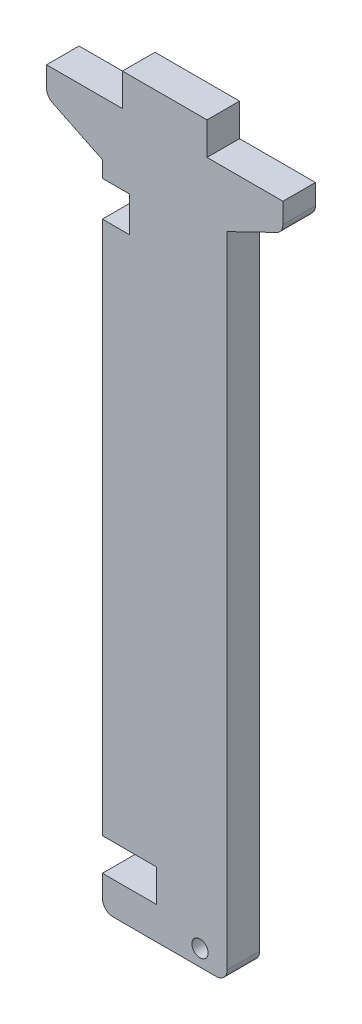
ISO-10303-21;
HEADER;
FILE_DESCRIPTION(('STEP AP214'),'2;1');
FILE_NAME('part.step','',(''),(''),'','','');
FILE_SCHEMA(('AUTOMOTIVE_DESIGN { 1 0 10303 214 1 1 1 1 }'));
ENDSEC;
DATA;
#1=APPLICATION_CONTEXT('core data for automotive mechanical design processes');
#2=APPLICATION_PROTOCOL_DEFINITION('international standard','automotive_design',2000,#1);
#3=PRODUCT_CONTEXT('',#1,'mechanical');
#4=PRODUCT('Part','Part','',(#3));
#5=PRODUCT_RELATED_PRODUCT_CATEGORY('part','',(#4));
#6=PRODUCT_DEFINITION_FORMATION('','',#4);
#7=PRODUCT_DEFINITION_CONTEXT('part definition',#1,'design');
#8=PRODUCT_DEFINITION('design','',#6,#7);
#9=PRODUCT_DEFINITION_SHAPE('','',#8);
#10=(LENGTH_UNIT() NAMED_UNIT(*) SI_UNIT(.MILLI.,.METRE.));
#11=(NAMED_UNIT(*) PLANE_ANGLE_UNIT() SI_UNIT($,.RADIAN.));
#12=(NAMED_UNIT(*) SI_UNIT($,.STERADIAN.) SOLID_ANGLE_UNIT());
#13=UNCERTAINTY_MEASURE_WITH_UNIT(LENGTH_MEASURE(1.E-05),#10,'distance_accuracy_value','');
#14=(GEOMETRIC_REPRESENTATION_CONTEXT(3) GLOBAL_UNCERTAINTY_ASSIGNED_CONTEXT((#13)) GLOBAL_UNIT_ASSIGNED_CONTEXT((#10,
#11,#12)) REPRESENTATION_CONTEXT('',''));
#15=CARTESIAN_POINT('',(0.,0.,0.));
#16=DIRECTION('',(0.,0.,1.));
#17=DIRECTION('',(1.,0.,0.));
#18=AXIS2_PLACEMENT_3D('',#15,#16,#17);
#19=CARTESIAN_POINT('',(10.3,0.,0.));
#20=DIRECTION('',(1.,0.,0.));
#21=DIRECTION('',(0.,1.,0.));
#22=AXIS2_PLACEMENT_3D('',#19,#20,#21);
#23=PLANE('',#22);
#24=DIRECTION('',(0.,1.,0.));
#25=VECTOR('',#24,1.);
#26=CARTESIAN_POINT('',(10.3,0.,0.));
#27=LINE('',#26,#25);
#28=CARTESIAN_POINT('',(10.3,117.,0.));
#29=VERTEX_POINT('',#28);
#30=CARTESIAN_POINT('',(10.3,120.,0.));
#31=VERTEX_POINT('',#30);
#32=EDGE_CURVE('E224',#29,#31,#27,.T.);
#33=ORIENTED_EDGE('',*,*,#32,.F.);
#34=DIRECTION('',(0.,0.,1.));
#35=VECTOR('',#34,1.);
#36=CARTESIAN_POINT('',(10.3,117.,0.));
#37=LINE('',#36,#35);
#38=CARTESIAN_POINT('',(10.3,117.,6.));
#39=VERTEX_POINT('',#38);
#40=EDGE_CURVE('E392',#29,#39,#37,.T.);
#41=ORIENTED_EDGE('',*,*,#40,.T.);
#42=DIRECTION('',(0.,1.,0.));
#43=VECTOR('',#42,1.);
#44=CARTESIAN_POINT('',(10.3,0.,6.));
#45=LINE('',#44,#43);
#46=CARTESIAN_POINT('',(10.3,120.,6.));
#47=VERTEX_POINT('',#46);
#48=EDGE_CURVE('E236',#39,#47,#45,.T.);
#49=ORIENTED_EDGE('',*,*,#48,.T.);
#50=DIRECTION('',(0.,0.,1.));
#51=VECTOR('',#50,1.);
#52=CARTESIAN_POINT('',(10.3,120.,0.));
#53=LINE('',#52,#51);
#54=EDGE_CURVE('E233',#31,#47,#53,.T.);
#55=ORIENTED_EDGE('',*,*,#54,.F.);
#56=EDGE_LOOP('',(#33,#41,#49,#55));
#57=FACE_BOUND('',#56,.T.);
#58=ADVANCED_FACE('F33',(#57),#23,.F.);
#59=CARTESIAN_POINT('',(10.3,12.,6.));
#60=VERTEX_POINT('',#59);
#61=CARTESIAN_POINT('',(10.3,110.5,6.));
#62=VERTEX_POINT('',#61);
#63=EDGE_CURVE('E214',#60,#62,#45,.T.);
#64=ORIENTED_EDGE('',*,*,#63,.T.);
#65=DIRECTION('',(0.,0.,1.));
#66=VECTOR('',#65,1.);
#67=CARTESIAN_POINT('',(10.3,110.5,0.));
#68=LINE('',#67,#66);
#69=CARTESIAN_POINT('',(10.3,110.5,0.));
#70=VERTEX_POINT('',#69);
#71=EDGE_CURVE('E199',#70,#62,#68,.T.);
#72=ORIENTED_EDGE('',*,*,#71,.F.);
#73=CARTESIAN_POINT('',(10.3,12.,0.));
#74=VERTEX_POINT('',#73);
#75=EDGE_CURVE('E212',#74,#70,#27,.T.);
#76=ORIENTED_EDGE('',*,*,#75,.F.);
#77=DIRECTION('',(0.,0.,1.));
#78=VECTOR('',#77,1.);
#79=CARTESIAN_POINT('',(10.3,12.,0.));
#80=LINE('',#79,#78);
#81=EDGE_CURVE('E404',#74,#60,#80,.T.);
#82=ORIENTED_EDGE('',*,*,#81,.T.);
#83=EDGE_LOOP('',(#64,#72,#76,#82));
#84=FACE_BOUND('',#83,.T.);
#85=ADVANCED_FACE('F210',(#84),#23,.F.);
#86=CARTESIAN_POINT('',(0.,130.,6.));
#87=DIRECTION('',(0.,-1.,0.));
#88=DIRECTION('',(0.,0.,-1.));
#89=AXIS2_PLACEMENT_3D('',#86,#87,#88);
#90=PLANE('',#89);
#91=DIRECTION('',(0.,0.,1.));
#92=VECTOR('',#91,1.);
#93=CARTESIAN_POINT('',(14.,130.,0.));
#94=LINE('',#93,#92);
#95=CARTESIAN_POINT('',(14.,130.,0.));
#96=VERTEX_POINT('',#95);
#97=CARTESIAN_POINT('',(14.,130.,6.));
#98=VERTEX_POINT('',#97);
#99=EDGE_CURVE('E415',#96,#98,#94,.T.);
#100=ORIENTED_EDGE('',*,*,#99,.F.);
#101=DIRECTION('',(-1.,0.,0.));
#102=VECTOR('',#101,1.);
#103=CARTESIAN_POINT('',(0.,130.,0.));
#104=LINE('',#103,#102);
#105=CARTESIAN_POINT('',(0.,130.,0.));
#106=VERTEX_POINT('',#105);
#107=EDGE_CURVE('E275',#96,#106,#104,.T.);
#108=ORIENTED_EDGE('',*,*,#107,.T.);
#109=DIRECTION('',(0.,0.,-1.));
#110=VECTOR('',#109,1.);
#111=CARTESIAN_POINT('',(0.,130.,6.));
#112=LINE('',#111,#110);
#113=CARTESIAN_POINT('',(0.,130.,6.));
#114=VERTEX_POINT('',#113);
#115=EDGE_CURVE('E274',#114,#106,#112,.T.);
#116=ORIENTED_EDGE('',*,*,#115,.F.);
#117=DIRECTION('',(-1.,0.,0.));
#118=VECTOR('',#117,1.);
#119=CARTESIAN_POINT('',(0.,130.,6.));
#120=LINE('',#119,#118);
#121=EDGE_CURVE('E263',#98,#114,#120,.T.);
#122=ORIENTED_EDGE('',*,*,#121,.F.);
#123=EDGE_LOOP('',(#100,#108,#116,#122));
#124=FACE_BOUND('',#123,.T.);
#125=ADVANCED_FACE('F348',(#124),#90,.F.);
#126=CARTESIAN_POINT('',(0.,0.,6.));
#127=DIRECTION('',(1.,0.,0.));
#128=DIRECTION('',(0.,1.,0.));
#129=AXIS2_PLACEMENT_3D('',#126,#127,#128);
#130=PLANE('',#129);
#131=DIRECTION('',(0.,-1.,0.));
#132=VECTOR('',#131,1.);
#133=CARTESIAN_POINT('',(0.,0.,0.));
#134=LINE('',#133,#132);
#135=CARTESIAN_POINT('',(0.,126.252321191351,0.));
#136=VERTEX_POINT('',#135);
#137=EDGE_CURVE('E253',#106,#136,#134,.T.);
#138=ORIENTED_EDGE('',*,*,#137,.T.);
#139=DIRECTION('',(0.,0.,1.));
#140=VECTOR('',#139,1.);
#141=CARTESIAN_POINT('',(0.,126.252321191351,6.));
#142=LINE('',#141,#140);
#143=CARTESIAN_POINT('',(0.,126.252321191351,6.));
#144=VERTEX_POINT('',#143);
#145=EDGE_CURVE('E41',#136,#144,#142,.T.);
#146=ORIENTED_EDGE('',*,*,#145,.T.);
#147=DIRECTION('',(0.,-1.,0.));
#148=VECTOR('',#147,1.);
#149=CARTESIAN_POINT('',(0.,0.,6.));
#150=LINE('',#149,#148);
#151=EDGE_CURVE('E254',#114,#144,#150,.T.);
#152=ORIENTED_EDGE('',*,*,#151,.F.);
#153=ORIENTED_EDGE('',*,*,#115,.T.);
#154=EDGE_LOOP('',(#138,#146,#152,#153));
#155=FACE_BOUND('',#154,.T.);
#156=ADVANCED_FACE('F334',(#155),#130,.F.);
#157=CARTESIAN_POINT('',(0.,0.,6.));
#158=DIRECTION('',(0.,1.,0.));
#159=DIRECTION('',(0.,0.,1.));
#160=AXIS2_PLACEMENT_3D('',#157,#158,#159);
#161=PLANE('',#160);
#162=DIRECTION('',(1.,0.,0.));
#163=VECTOR('',#162,1.);
#164=CARTESIAN_POINT('',(0.,0.,0.));
#165=LINE('',#164,#163);
#166=CARTESIAN_POINT('',(12.3,0.,0.));
#167=VERTEX_POINT('',#166);
#168=CARTESIAN_POINT('',(31.3,0.,0.));
#169=VERTEX_POINT('',#168);
#170=EDGE_CURVE('E351',#167,#169,#165,.T.);
#171=ORIENTED_EDGE('',*,*,#170,.T.);
#172=DIRECTION('',(0.,0.,1.));
#173=VECTOR('',#172,1.);
#174=CARTESIAN_POINT('',(31.3,0.,6.));
#175=LINE('',#174,#173);
#176=CARTESIAN_POINT('',(31.3,0.,6.));
#177=VERTEX_POINT('',#176);
#178=EDGE_CURVE('E293',#169,#177,#175,.T.);
#179=ORIENTED_EDGE('',*,*,#178,.T.);
#180=DIRECTION('',(1.,0.,0.));
#181=VECTOR('',#180,1.);
#182=CARTESIAN_POINT('',(0.,0.,6.));
#183=LINE('',#182,#181);
#184=CARTESIAN_POINT('',(12.3,0.,6.));
#185=VERTEX_POINT('',#184);
#186=EDGE_CURVE('E257',#185,#177,#183,.T.);
#187=ORIENTED_EDGE('',*,*,#186,.F.);
#188=DIRECTION('',(0.,0.,1.));
#189=VECTOR('',#188,1.);
#190=CARTESIAN_POINT('',(12.3,0.,6.));
#191=LINE('',#190,#189);
#192=EDGE_CURVE('E287',#185,#167,#191,.F.);
#193=ORIENTED_EDGE('',*,*,#192,.T.);
#194=EDGE_LOOP('',(#171,#179,#187,#193));
#195=FACE_BOUND('',#194,.T.);
#196=ADVANCED_FACE('F498',(#195),#161,.F.);
#197=CARTESIAN_POINT('',(43.6,0.,6.));
#198=DIRECTION('',(-1.,0.,0.));
#199=DIRECTION('',(0.,-1.,0.));
#200=AXIS2_PLACEMENT_3D('',#197,#198,#199);
#201=PLANE('',#200);
#202=DIRECTION('',(0.,1.,0.));
#203=VECTOR('',#202,1.);
#204=CARTESIAN_POINT('',(43.6,0.,6.));
#205=LINE('',#204,#203);
#206=CARTESIAN_POINT('',(43.6,126.252321191351,6.));
#207=VERTEX_POINT('',#206);
#208=CARTESIAN_POINT('',(43.6,130.,6.));
#209=VERTEX_POINT('',#208);
#210=EDGE_CURVE('E261',#207,#209,#205,.T.);
#211=ORIENTED_EDGE('',*,*,#210,.F.);
#212=DIRECTION('',(0.,0.,1.));
#213=VECTOR('',#212,1.);
#214=CARTESIAN_POINT('',(43.6,126.252321191351,6.));
#215=LINE('',#214,#213);
#216=CARTESIAN_POINT('',(43.6,126.252321191351,0.));
#217=VERTEX_POINT('',#216);
#218=EDGE_CURVE('E326',#207,#217,#215,.F.);
#219=ORIENTED_EDGE('',*,*,#218,.T.);
#220=DIRECTION('',(0.,1.,0.));
#221=VECTOR('',#220,1.);
#222=CARTESIAN_POINT('',(43.6,0.,0.));
#223=LINE('',#222,#221);
#224=CARTESIAN_POINT('',(43.6,130.,0.));
#225=VERTEX_POINT('',#224);
#226=EDGE_CURVE('E278',#217,#225,#223,.T.);
#227=ORIENTED_EDGE('',*,*,#226,.T.);
#228=DIRECTION('',(0.,0.,-1.));
#229=VECTOR('',#228,1.);
#230=CARTESIAN_POINT('',(43.6,130.,6.));
#231=LINE('',#230,#229);
#232=EDGE_CURVE('E285',#209,#225,#231,.T.);
#233=ORIENTED_EDGE('',*,*,#232,.F.);
#234=EDGE_LOOP('',(#211,#219,#227,#233));
#235=FACE_BOUND('',#234,.T.);
#236=ADVANCED_FACE('F355',(#235),#201,.F.);
#237=CARTESIAN_POINT('',(29.6,130.,0.));
#238=VERTEX_POINT('',#237);
#239=EDGE_CURVE('E258',#225,#238,#104,.T.);
#240=ORIENTED_EDGE('',*,*,#239,.T.);
#241=DIRECTION('',(0.,0.,1.));
#242=VECTOR('',#241,1.);
#243=CARTESIAN_POINT('',(29.6,130.,0.));
#244=LINE('',#243,#242);
#245=CARTESIAN_POINT('',(29.6,130.,6.));
#246=VERTEX_POINT('',#245);
#247=EDGE_CURVE('E424',#238,#246,#244,.T.);
#248=ORIENTED_EDGE('',*,*,#247,.T.);
#249=EDGE_CURVE('E271',#209,#246,#120,.T.);
#250=ORIENTED_EDGE('',*,*,#249,.F.);
#251=ORIENTED_EDGE('',*,*,#232,.T.);
#252=EDGE_LOOP('',(#240,#248,#250,#251));
#253=FACE_BOUND('',#252,.T.);
#254=ADVANCED_FACE('F446',(#253),#90,.F.);
#255=CARTESIAN_POINT('',(0.,0.,6.));
#256=DIRECTION('',(0.,0.,-1.));
#257=DIRECTION('',(-1.,0.,0.));
#258=AXIS2_PLACEMENT_3D('',#255,#256,#257);
#259=PLANE('',#258);
#260=CARTESIAN_POINT('',(28.3,3.,6.));
#261=DIRECTION('',(0.,0.,1.));
#262=DIRECTION('',(1.,0.,0.));
#263=AXIS2_PLACEMENT_3D('',#260,#261,#262);
#264=CIRCLE('',#263,1.5);
#265=CARTESIAN_POINT('',(29.8,3.,6.));
#266=VERTEX_POINT('',#265);
#267=EDGE_CURVE('E672',#266,#266,#264,.T.);
#268=ORIENTED_EDGE('',*,*,#267,.F.);
#269=EDGE_LOOP('',(#268));
#270=FACE_BOUND('',#269,.T.);
#271=DIRECTION('',(-0.899606206386735,-0.436702041935308,0.));
#272=VECTOR('',#271,1.);
#273=CARTESIAN_POINT('',(43.6,125.,6.));
#274=LINE('',#273,#272);
#275=CARTESIAN_POINT('',(42.4734040838706,124.453108778578,6.));
#276=VERTEX_POINT('',#275);
#277=CARTESIAN_POINT('',(33.3,120.,6.));
#278=VERTEX_POINT('',#277);
#279=EDGE_CURVE('E240',#276,#278,#274,.T.);
#280=ORIENTED_EDGE('',*,*,#279,.F.);
#281=CARTESIAN_POINT('',(41.6,126.252321191351,6.));
#282=DIRECTION('',(0.,0.,-1.));
#283=DIRECTION('',(-1.,0.,0.));
#284=AXIS2_PLACEMENT_3D('',#281,#282,#283);
#285=CIRCLE('',#284,2.);
#286=EDGE_CURVE('E324',#276,#207,#285,.F.);
#287=ORIENTED_EDGE('',*,*,#286,.T.);
#288=ORIENTED_EDGE('',*,*,#210,.T.);
#289=ORIENTED_EDGE('',*,*,#249,.T.);
#290=DIRECTION('',(0.,1.,0.));
#291=VECTOR('',#290,1.);
#292=CARTESIAN_POINT('',(29.6,130.,6.));
#293=LINE('',#292,#291);
#294=CARTESIAN_POINT('',(29.6,136.,6.));
#295=VERTEX_POINT('',#294);
#296=EDGE_CURVE('E420',#246,#295,#293,.T.);
#297=ORIENTED_EDGE('',*,*,#296,.T.);
#298=DIRECTION('',(-1.,0.,0.));
#299=VECTOR('',#298,1.);
#300=CARTESIAN_POINT('',(14.,136.,6.));
#301=LINE('',#300,#299);
#302=CARTESIAN_POINT('',(14.,136.,6.));
#303=VERTEX_POINT('',#302);
#304=EDGE_CURVE('E417',#295,#303,#301,.T.);
#305=ORIENTED_EDGE('',*,*,#304,.T.);
#306=DIRECTION('',(0.,-1.,0.));
#307=VECTOR('',#306,1.);
#308=CARTESIAN_POINT('',(14.,130.,6.));
#309=LINE('',#308,#307);
#310=EDGE_CURVE('E345',#303,#98,#309,.T.);
#311=ORIENTED_EDGE('',*,*,#310,.T.);
#312=ORIENTED_EDGE('',*,*,#121,.T.);
#313=ORIENTED_EDGE('',*,*,#151,.T.);
#314=CARTESIAN_POINT('',(1.99999999999998,126.252321191351,6.));
#315=DIRECTION('',(0.,0.,-1.));
#316=DIRECTION('',(-1.,0.,0.));
#317=AXIS2_PLACEMENT_3D('',#314,#315,#316);
#318=CIRCLE('',#317,2.);
#319=CARTESIAN_POINT('',(1.12659591612936,124.453108778578,6.));
#320=VERTEX_POINT('',#319);
#321=EDGE_CURVE('E322',#144,#320,#318,.F.);
#322=ORIENTED_EDGE('',*,*,#321,.T.);
#323=DIRECTION('',(-0.899606206386735,0.436702041935307,0.));
#324=VECTOR('',#323,1.);
#325=CARTESIAN_POINT('',(10.3,120.,6.));
#326=LINE('',#325,#324);
#327=EDGE_CURVE('E227',#47,#320,#326,.T.);
#328=ORIENTED_EDGE('',*,*,#327,.F.);
#329=ORIENTED_EDGE('',*,*,#48,.F.);
#330=DIRECTION('',(-1.,0.,0.));
#331=VECTOR('',#330,1.);
#332=CARTESIAN_POINT('',(10.3,117.,6.));
#333=LINE('',#332,#331);
#334=CARTESIAN_POINT('',(15.3,117.,6.));
#335=VERTEX_POINT('',#334);
#336=EDGE_CURVE('E205',#335,#39,#333,.T.);
#337=ORIENTED_EDGE('',*,*,#336,.F.);
#338=DIRECTION('',(0.,1.,0.));
#339=VECTOR('',#338,1.);
#340=CARTESIAN_POINT('',(15.3,117.,6.));
#341=LINE('',#340,#339);
#342=CARTESIAN_POINT('',(15.3,110.5,6.));
#343=VERTEX_POINT('',#342);
#344=EDGE_CURVE('E653',#343,#335,#341,.T.);
#345=ORIENTED_EDGE('',*,*,#344,.F.);
#346=DIRECTION('',(1.,0.,0.));
#347=VECTOR('',#346,1.);
#348=CARTESIAN_POINT('',(10.3,110.5,6.));
#349=LINE('',#348,#347);
#350=EDGE_CURVE('E656',#62,#343,#349,.T.);
#351=ORIENTED_EDGE('',*,*,#350,.F.);
#352=ORIENTED_EDGE('',*,*,#63,.F.);
#353=DIRECTION('',(-1.,0.,0.));
#354=VECTOR('',#353,1.);
#355=CARTESIAN_POINT('',(10.3,12.,6.));
#356=LINE('',#355,#354);
#357=CARTESIAN_POINT('',(20.3,12.,6.));
#358=VERTEX_POINT('',#357);
#359=EDGE_CURVE('E394',#358,#60,#356,.T.);
#360=ORIENTED_EDGE('',*,*,#359,.F.);
#361=DIRECTION('',(0.,1.,0.));
#362=VECTOR('',#361,1.);
#363=CARTESIAN_POINT('',(20.3,6.,6.));
#364=LINE('',#363,#362);
#365=CARTESIAN_POINT('',(20.3,6.,6.));
#366=VERTEX_POINT('',#365);
#367=EDGE_CURVE('E390',#366,#358,#364,.T.);
#368=ORIENTED_EDGE('',*,*,#367,.F.);
#369=DIRECTION('',(1.,0.,0.));
#370=VECTOR('',#369,1.);
#371=CARTESIAN_POINT('',(10.3,6.,6.));
#372=LINE('',#371,#370);
#373=CARTESIAN_POINT('',(10.3,6.,6.));
#374=VERTEX_POINT('',#373);
#375=EDGE_CURVE('E387',#374,#366,#372,.T.);
#376=ORIENTED_EDGE('',*,*,#375,.F.);
#377=CARTESIAN_POINT('',(10.3,2.,6.));
#378=VERTEX_POINT('',#377);
#379=EDGE_CURVE('E234',#378,#374,#45,.T.);
#380=ORIENTED_EDGE('',*,*,#379,.F.);
#381=CARTESIAN_POINT('',(12.3,2.,6.));
#382=DIRECTION('',(0.,0.,-1.));
#383=DIRECTION('',(-1.,0.,0.));
#384=AXIS2_PLACEMENT_3D('',#381,#382,#383);
#385=CIRCLE('',#384,2.);
#386=EDGE_CURVE('E301',#378,#185,#385,.F.);
#387=ORIENTED_EDGE('',*,*,#386,.T.);
#388=ORIENTED_EDGE('',*,*,#186,.T.);
#389=CARTESIAN_POINT('',(31.3,2.,6.));
#390=DIRECTION('',(0.,0.,-1.));
#391=DIRECTION('',(-1.,0.,0.));
#392=AXIS2_PLACEMENT_3D('',#389,#390,#391);
#393=CIRCLE('',#392,2.);
#394=CARTESIAN_POINT('',(33.3,2.,6.));
#395=VERTEX_POINT('',#394);
#396=EDGE_CURVE('E308',#177,#395,#393,.F.);
#397=ORIENTED_EDGE('',*,*,#396,.T.);
#398=DIRECTION('',(0.,-1.,0.));
#399=VECTOR('',#398,1.);
#400=CARTESIAN_POINT('',(33.3,0.,6.));
#401=LINE('',#400,#399);
#402=EDGE_CURVE('E244',#278,#395,#401,.T.);
#403=ORIENTED_EDGE('',*,*,#402,.F.);
#404=EDGE_LOOP('',(#280,#287,#288,#289,#297,#305,#311,#312,#313,#322,#328,#329,#337,#345,#351,
#352,#360,#368,#376,#380,#387,#388,#397,#403));
#405=FACE_BOUND('',#404,.T.);
#406=ADVANCED_FACE('F338',(#270,#405),#259,.F.);
#407=CARTESIAN_POINT('',(0.,0.,0.));
#408=DIRECTION('',(0.,0.,-1.));
#409=DIRECTION('',(-1.,0.,0.));
#410=AXIS2_PLACEMENT_3D('',#407,#408,#409);
#411=PLANE('',#410);
#412=CARTESIAN_POINT('',(28.3,3.,0.));
#413=DIRECTION('',(0.,0.,1.));
#414=DIRECTION('',(1.,0.,0.));
#415=AXIS2_PLACEMENT_3D('',#412,#413,#414);
#416=CIRCLE('',#415,1.5);
#417=CARTESIAN_POINT('',(29.8,3.,0.));
#418=VERTEX_POINT('',#417);
#419=EDGE_CURVE('E670',#418,#418,#416,.T.);
#420=ORIENTED_EDGE('',*,*,#419,.T.);
#421=EDGE_LOOP('',(#420));
#422=FACE_BOUND('',#421,.T.);
#423=ORIENTED_EDGE('',*,*,#226,.F.);
#424=CARTESIAN_POINT('',(41.6,126.252321191351,0.));
#425=DIRECTION('',(0.,0.,-1.));
#426=DIRECTION('',(-1.,0.,0.));
#427=AXIS2_PLACEMENT_3D('',#424,#425,#426);
#428=CIRCLE('',#427,2.);
#429=CARTESIAN_POINT('',(42.4734040838706,124.453108778578,0.));
#430=VERTEX_POINT('',#429);
#431=EDGE_CURVE('E329',#217,#430,#428,.T.);
#432=ORIENTED_EDGE('',*,*,#431,.T.);
#433=DIRECTION('',(-0.899606206386735,-0.436702041935308,0.));
#434=VECTOR('',#433,1.);
#435=CARTESIAN_POINT('',(43.6,125.,0.));
#436=LINE('',#435,#434);
#437=CARTESIAN_POINT('',(33.3,120.,0.));
#438=VERTEX_POINT('',#437);
#439=EDGE_CURVE('E241',#430,#438,#436,.T.);
#440=ORIENTED_EDGE('',*,*,#439,.T.);
#441=DIRECTION('',(0.,-1.,0.));
#442=VECTOR('',#441,1.);
#443=CARTESIAN_POINT('',(33.3,0.,0.));
#444=LINE('',#443,#442);
#445=CARTESIAN_POINT('',(33.3,2.,0.));
#446=VERTEX_POINT('',#445);
#447=EDGE_CURVE('E243',#438,#446,#444,.T.);
#448=ORIENTED_EDGE('',*,*,#447,.T.);
#449=CARTESIAN_POINT('',(31.3,2.,0.));
#450=DIRECTION('',(0.,0.,-1.));
#451=DIRECTION('',(-1.,0.,0.));
#452=AXIS2_PLACEMENT_3D('',#449,#450,#451);
#453=CIRCLE('',#452,2.);
#454=EDGE_CURVE('E314',#446,#169,#453,.T.);
#455=ORIENTED_EDGE('',*,*,#454,.T.);
#456=ORIENTED_EDGE('',*,*,#170,.F.);
#457=CARTESIAN_POINT('',(12.3,2.,0.));
#458=DIRECTION('',(0.,0.,-1.));
#459=DIRECTION('',(-1.,0.,0.));
#460=AXIS2_PLACEMENT_3D('',#457,#458,#459);
#461=CIRCLE('',#460,2.);
#462=CARTESIAN_POINT('',(10.3,2.,0.));
#463=VERTEX_POINT('',#462);
#464=EDGE_CURVE('E312',#167,#463,#461,.T.);
#465=ORIENTED_EDGE('',*,*,#464,.T.);
#466=CARTESIAN_POINT('',(10.3,6.,0.));
#467=VERTEX_POINT('',#466);
#468=EDGE_CURVE('E223',#463,#467,#27,.T.);
#469=ORIENTED_EDGE('',*,*,#468,.T.);
#470=DIRECTION('',(1.,0.,0.));
#471=VECTOR('',#470,1.);
#472=CARTESIAN_POINT('',(10.3,6.,0.));
#473=LINE('',#472,#471);
#474=CARTESIAN_POINT('',(20.3,6.,0.));
#475=VERTEX_POINT('',#474);
#476=EDGE_CURVE('E403',#467,#475,#473,.T.);
#477=ORIENTED_EDGE('',*,*,#476,.T.);
#478=DIRECTION('',(0.,1.,0.));
#479=VECTOR('',#478,1.);
#480=CARTESIAN_POINT('',(20.3,6.,0.));
#481=LINE('',#480,#479);
#482=CARTESIAN_POINT('',(20.3,12.,0.));
#483=VERTEX_POINT('',#482);
#484=EDGE_CURVE('E664',#475,#483,#481,.T.);
#485=ORIENTED_EDGE('',*,*,#484,.T.);
#486=DIRECTION('',(-1.,0.,0.));
#487=VECTOR('',#486,1.);
#488=CARTESIAN_POINT('',(10.3,12.,0.));
#489=LINE('',#488,#487);
#490=EDGE_CURVE('E222',#483,#74,#489,.T.);
#491=ORIENTED_EDGE('',*,*,#490,.T.);
#492=ORIENTED_EDGE('',*,*,#75,.T.);
#493=DIRECTION('',(1.,0.,0.));
#494=VECTOR('',#493,1.);
#495=CARTESIAN_POINT('',(10.3,110.5,0.));
#496=LINE('',#495,#494);
#497=CARTESIAN_POINT('',(15.3,110.5,0.));
#498=VERTEX_POINT('',#497);
#499=EDGE_CURVE('E195',#70,#498,#496,.T.);
#500=ORIENTED_EDGE('',*,*,#499,.T.);
#501=DIRECTION('',(0.,1.,0.));
#502=VECTOR('',#501,1.);
#503=CARTESIAN_POINT('',(15.3,117.,0.));
#504=LINE('',#503,#502);
#505=CARTESIAN_POINT('',(15.3,117.,0.));
#506=VERTEX_POINT('',#505);
#507=EDGE_CURVE('E204',#498,#506,#504,.T.);
#508=ORIENTED_EDGE('',*,*,#507,.T.);
#509=DIRECTION('',(-1.,0.,0.));
#510=VECTOR('',#509,1.);
#511=CARTESIAN_POINT('',(10.3,117.,0.));
#512=LINE('',#511,#510);
#513=EDGE_CURVE('E215',#506,#29,#512,.T.);
#514=ORIENTED_EDGE('',*,*,#513,.T.);
#515=ORIENTED_EDGE('',*,*,#32,.T.);
#516=DIRECTION('',(-0.899606206386735,0.436702041935307,0.));
#517=VECTOR('',#516,1.);
#518=CARTESIAN_POINT('',(10.3,120.,0.));
#519=LINE('',#518,#517);
#520=CARTESIAN_POINT('',(1.12659591612936,124.453108778578,0.));
#521=VERTEX_POINT('',#520);
#522=EDGE_CURVE('E226',#31,#521,#519,.T.);
#523=ORIENTED_EDGE('',*,*,#522,.T.);
#524=CARTESIAN_POINT('',(1.99999999999998,126.252321191351,0.));
#525=DIRECTION('',(0.,0.,-1.));
#526=DIRECTION('',(-1.,0.,0.));
#527=AXIS2_PLACEMENT_3D('',#524,#525,#526);
#528=CIRCLE('',#527,2.);
#529=EDGE_CURVE('E48',#521,#136,#528,.T.);
#530=ORIENTED_EDGE('',*,*,#529,.T.);
#531=ORIENTED_EDGE('',*,*,#137,.F.);
#532=ORIENTED_EDGE('',*,*,#107,.F.);
#533=DIRECTION('',(0.,-1.,0.));
#534=VECTOR('',#533,1.);
#535=CARTESIAN_POINT('',(14.,130.,0.));
#536=LINE('',#535,#534);
#537=CARTESIAN_POINT('',(14.,136.,0.));
#538=VERTEX_POINT('',#537);
#539=EDGE_CURVE('E419',#538,#96,#536,.T.);
#540=ORIENTED_EDGE('',*,*,#539,.F.);
#541=DIRECTION('',(-1.,0.,0.));
#542=VECTOR('',#541,1.);
#543=CARTESIAN_POINT('',(14.,136.,0.));
#544=LINE('',#543,#542);
#545=CARTESIAN_POINT('',(29.6,136.,0.));
#546=VERTEX_POINT('',#545);
#547=EDGE_CURVE('E412',#546,#538,#544,.T.);
#548=ORIENTED_EDGE('',*,*,#547,.F.);
#549=DIRECTION('',(0.,1.,0.));
#550=VECTOR('',#549,1.);
#551=CARTESIAN_POINT('',(29.6,130.,0.));
#552=LINE('',#551,#550);
#553=EDGE_CURVE('E416',#238,#546,#552,.T.);
#554=ORIENTED_EDGE('',*,*,#553,.F.);
#555=ORIENTED_EDGE('',*,*,#239,.F.);
#556=EDGE_LOOP('',(#423,#432,#440,#448,#455,#456,#465,#469,#477,#485,#491,#492,#500,#508,#514,
#515,#523,#530,#531,#532,#540,#548,#554,#555));
#557=FACE_BOUND('',#556,.T.);
#558=ADVANCED_FACE('F219',(#422,#557),#411,.T.);
#559=CARTESIAN_POINT('',(33.3,0.,0.));
#560=DIRECTION('',(-1.,0.,0.));
#561=DIRECTION('',(0.,-1.,0.));
#562=AXIS2_PLACEMENT_3D('',#559,#560,#561);
#563=PLANE('',#562);
#564=ORIENTED_EDGE('',*,*,#402,.T.);
#565=DIRECTION('',(0.,0.,1.));
#566=VECTOR('',#565,1.);
#567=CARTESIAN_POINT('',(33.3,2.,0.));
#568=LINE('',#567,#566);
#569=EDGE_CURVE('E310',#395,#446,#568,.F.);
#570=ORIENTED_EDGE('',*,*,#569,.T.);
#571=ORIENTED_EDGE('',*,*,#447,.F.);
#572=DIRECTION('',(0.,0.,1.));
#573=VECTOR('',#572,1.);
#574=CARTESIAN_POINT('',(33.3,120.,0.));
#575=LINE('',#574,#573);
#576=EDGE_CURVE('E247',#438,#278,#575,.T.);
#577=ORIENTED_EDGE('',*,*,#576,.T.);
#578=EDGE_LOOP('',(#564,#570,#571,#577));
#579=FACE_BOUND('',#578,.T.);
#580=ADVANCED_FACE('F369',(#579),#563,.F.);
#581=CARTESIAN_POINT('',(43.6,125.,0.));
#582=DIRECTION('',(-0.436702041935308,0.899606206386735,0.));
#583=DIRECTION('',(-0.899606206386735,-0.436702041935308,0.));
#584=AXIS2_PLACEMENT_3D('',#581,#582,#583);
#585=PLANE('',#584);
#586=ORIENTED_EDGE('',*,*,#439,.F.);
#587=DIRECTION('',(0.,0.,1.));
#588=VECTOR('',#587,1.);
#589=CARTESIAN_POINT('',(42.4734040838706,124.453108778578,0.));
#590=LINE('',#589,#588);
#591=EDGE_CURVE('E319',#430,#276,#590,.T.);
#592=ORIENTED_EDGE('',*,*,#591,.T.);
#593=ORIENTED_EDGE('',*,*,#279,.T.);
#594=ORIENTED_EDGE('',*,*,#576,.F.);
#595=EDGE_LOOP('',(#586,#592,#593,#594));
#596=FACE_BOUND('',#595,.T.);
#597=ADVANCED_FACE('F364',(#596),#585,.F.);
#598=CARTESIAN_POINT('',(10.3,120.,0.));
#599=DIRECTION('',(0.436702041935307,0.899606206386735,0.));
#600=DIRECTION('',(-0.899606206386735,0.436702041935307,0.));
#601=AXIS2_PLACEMENT_3D('',#598,#599,#600);
#602=PLANE('',#601);
#603=ORIENTED_EDGE('',*,*,#327,.T.);
#604=DIRECTION('',(0.,0.,1.));
#605=VECTOR('',#604,1.);
#606=CARTESIAN_POINT('',(1.12659591612936,124.453108778578,0.));
#607=LINE('',#606,#605);
#608=EDGE_CURVE('E11',#320,#521,#607,.F.);
#609=ORIENTED_EDGE('',*,*,#608,.T.);
#610=ORIENTED_EDGE('',*,*,#522,.F.);
#611=ORIENTED_EDGE('',*,*,#54,.T.);
#612=EDGE_LOOP('',(#603,#609,#610,#611));
#613=FACE_BOUND('',#612,.T.);
#614=ADVANCED_FACE('F470',(#613),#602,.F.);
#615=ORIENTED_EDGE('',*,*,#468,.F.);
#616=DIRECTION('',(0.,0.,1.));
#617=VECTOR('',#616,1.);
#618=CARTESIAN_POINT('',(10.3,2.,0.));
#619=LINE('',#618,#617);
#620=EDGE_CURVE('E316',#463,#378,#619,.T.);
#621=ORIENTED_EDGE('',*,*,#620,.T.);
#622=ORIENTED_EDGE('',*,*,#379,.T.);
#623=DIRECTION('',(0.,0.,1.));
#624=VECTOR('',#623,1.);
#625=CARTESIAN_POINT('',(10.3,6.,0.));
#626=LINE('',#625,#624);
#627=EDGE_CURVE('E410',#467,#374,#626,.T.);
#628=ORIENTED_EDGE('',*,*,#627,.F.);
#629=EDGE_LOOP('',(#615,#621,#622,#628));
#630=FACE_BOUND('',#629,.T.);
#631=ADVANCED_FACE('F381',(#630),#23,.F.);
#632=CARTESIAN_POINT('',(14.,130.,0.));
#633=DIRECTION('',(-1.,0.,0.));
#634=DIRECTION('',(0.,0.,1.));
#635=AXIS2_PLACEMENT_3D('',#632,#633,#634);
#636=PLANE('',#635);
#637=ORIENTED_EDGE('',*,*,#310,.F.);
#638=DIRECTION('',(0.,0.,1.));
#639=VECTOR('',#638,1.);
#640=CARTESIAN_POINT('',(14.,136.,0.));
#641=LINE('',#640,#639);
#642=EDGE_CURVE('E421',#538,#303,#641,.T.);
#643=ORIENTED_EDGE('',*,*,#642,.F.);
#644=ORIENTED_EDGE('',*,*,#539,.T.);
#645=ORIENTED_EDGE('',*,*,#99,.T.);
#646=EDGE_LOOP('',(#637,#643,#644,#645));
#647=FACE_BOUND('',#646,.T.);
#648=ADVANCED_FACE('F445',(#647),#636,.T.);
#649=CARTESIAN_POINT('',(14.,136.,0.));
#650=DIRECTION('',(0.,1.,0.));
#651=DIRECTION('',(0.,0.,1.));
#652=AXIS2_PLACEMENT_3D('',#649,#650,#651);
#653=PLANE('',#652);
#654=ORIENTED_EDGE('',*,*,#304,.F.);
#655=DIRECTION('',(0.,0.,1.));
#656=VECTOR('',#655,1.);
#657=CARTESIAN_POINT('',(29.6,136.,0.));
#658=LINE('',#657,#656);
#659=EDGE_CURVE('E423',#546,#295,#658,.T.);
#660=ORIENTED_EDGE('',*,*,#659,.F.);
#661=ORIENTED_EDGE('',*,*,#547,.T.);
#662=ORIENTED_EDGE('',*,*,#642,.T.);
#663=EDGE_LOOP('',(#654,#660,#661,#662));
#664=FACE_BOUND('',#663,.T.);
#665=ADVANCED_FACE('F442',(#664),#653,.T.);
#666=CARTESIAN_POINT('',(29.6,130.,0.));
#667=DIRECTION('',(1.,0.,0.));
#668=DIRECTION('',(0.,0.,-1.));
#669=AXIS2_PLACEMENT_3D('',#666,#667,#668);
#670=PLANE('',#669);
#671=ORIENTED_EDGE('',*,*,#296,.F.);
#672=ORIENTED_EDGE('',*,*,#247,.F.);
#673=ORIENTED_EDGE('',*,*,#553,.T.);
#674=ORIENTED_EDGE('',*,*,#659,.T.);
#675=EDGE_LOOP('',(#671,#672,#673,#674));
#676=FACE_BOUND('',#675,.T.);
#677=ADVANCED_FACE('F447',(#676),#670,.T.);
#678=CARTESIAN_POINT('',(10.3,12.,0.));
#679=DIRECTION('',(0.,1.,0.));
#680=DIRECTION('',(0.,0.,1.));
#681=AXIS2_PLACEMENT_3D('',#678,#679,#680);
#682=PLANE('',#681);
#683=ORIENTED_EDGE('',*,*,#359,.T.);
#684=ORIENTED_EDGE('',*,*,#81,.F.);
#685=ORIENTED_EDGE('',*,*,#490,.F.);
#686=DIRECTION('',(0.,0.,1.));
#687=VECTOR('',#686,1.);
#688=CARTESIAN_POINT('',(20.3,12.,0.));
#689=LINE('',#688,#687);
#690=EDGE_CURVE('E406',#483,#358,#689,.T.);
#691=ORIENTED_EDGE('',*,*,#690,.T.);
#692=EDGE_LOOP('',(#683,#684,#685,#691));
#693=FACE_BOUND('',#692,.T.);
#694=ADVANCED_FACE('F449',(#693),#682,.F.);
#695=CARTESIAN_POINT('',(20.3,6.,0.));
#696=DIRECTION('',(1.,0.,0.));
#697=DIRECTION('',(0.,0.,-1.));
#698=AXIS2_PLACEMENT_3D('',#695,#696,#697);
#699=PLANE('',#698);
#700=ORIENTED_EDGE('',*,*,#367,.T.);
#701=ORIENTED_EDGE('',*,*,#690,.F.);
#702=ORIENTED_EDGE('',*,*,#484,.F.);
#703=DIRECTION('',(0.,0.,1.));
#704=VECTOR('',#703,1.);
#705=CARTESIAN_POINT('',(20.3,6.,0.));
#706=LINE('',#705,#704);
#707=EDGE_CURVE('E408',#475,#366,#706,.T.);
#708=ORIENTED_EDGE('',*,*,#707,.T.);
#709=EDGE_LOOP('',(#700,#701,#702,#708));
#710=FACE_BOUND('',#709,.T.);
#711=ADVANCED_FACE('F455',(#710),#699,.F.);
#712=CARTESIAN_POINT('',(10.3,6.,0.));
#713=DIRECTION('',(0.,-1.,0.));
#714=DIRECTION('',(0.,0.,-1.));
#715=AXIS2_PLACEMENT_3D('',#712,#713,#714);
#716=PLANE('',#715);
#717=ORIENTED_EDGE('',*,*,#375,.T.);
#718=ORIENTED_EDGE('',*,*,#707,.F.);
#719=ORIENTED_EDGE('',*,*,#476,.F.);
#720=ORIENTED_EDGE('',*,*,#627,.T.);
#721=EDGE_LOOP('',(#717,#718,#719,#720));
#722=FACE_BOUND('',#721,.T.);
#723=ADVANCED_FACE('F596',(#722),#716,.F.);
#724=CARTESIAN_POINT('',(10.3,117.,0.));
#725=DIRECTION('',(0.,1.,0.));
#726=DIRECTION('',(0.,0.,1.));
#727=AXIS2_PLACEMENT_3D('',#724,#725,#726);
#728=PLANE('',#727);
#729=ORIENTED_EDGE('',*,*,#336,.T.);
#730=ORIENTED_EDGE('',*,*,#40,.F.);
#731=ORIENTED_EDGE('',*,*,#513,.F.);
#732=DIRECTION('',(0.,0.,1.));
#733=VECTOR('',#732,1.);
#734=CARTESIAN_POINT('',(15.3,117.,0.));
#735=LINE('',#734,#733);
#736=EDGE_CURVE('E397',#506,#335,#735,.T.);
#737=ORIENTED_EDGE('',*,*,#736,.T.);
#738=EDGE_LOOP('',(#729,#730,#731,#737));
#739=FACE_BOUND('',#738,.T.);
#740=ADVANCED_FACE('F606',(#739),#728,.F.);
#741=CARTESIAN_POINT('',(15.3,117.,0.));
#742=DIRECTION('',(1.,0.,0.));
#743=DIRECTION('',(0.,0.,-1.));
#744=AXIS2_PLACEMENT_3D('',#741,#742,#743);
#745=PLANE('',#744);
#746=ORIENTED_EDGE('',*,*,#344,.T.);
#747=ORIENTED_EDGE('',*,*,#736,.F.);
#748=ORIENTED_EDGE('',*,*,#507,.F.);
#749=DIRECTION('',(0.,0.,1.));
#750=VECTOR('',#749,1.);
#751=CARTESIAN_POINT('',(15.3,110.5,0.));
#752=LINE('',#751,#750);
#753=EDGE_CURVE('E201',#498,#343,#752,.T.);
#754=ORIENTED_EDGE('',*,*,#753,.T.);
#755=EDGE_LOOP('',(#746,#747,#748,#754));
#756=FACE_BOUND('',#755,.T.);
#757=ADVANCED_FACE('F615',(#756),#745,.F.);
#758=CARTESIAN_POINT('',(10.3,110.5,0.));
#759=DIRECTION('',(0.,-1.,0.));
#760=DIRECTION('',(0.,0.,-1.));
#761=AXIS2_PLACEMENT_3D('',#758,#759,#760);
#762=PLANE('',#761);
#763=ORIENTED_EDGE('',*,*,#350,.T.);
#764=ORIENTED_EDGE('',*,*,#753,.F.);
#765=ORIENTED_EDGE('',*,*,#499,.F.);
#766=ORIENTED_EDGE('',*,*,#71,.T.);
#767=EDGE_LOOP('',(#763,#764,#765,#766));
#768=FACE_BOUND('',#767,.T.);
#769=ADVANCED_FACE('F198',(#768),#762,.F.);
#770=CARTESIAN_POINT('',(31.3,2.,6.));
#771=DIRECTION('',(0.,0.,1.));
#772=DIRECTION('',(1.,0.,0.));
#773=AXIS2_PLACEMENT_3D('',#770,#771,#772);
#774=CYLINDRICAL_SURFACE('',#773,2.);
#775=ORIENTED_EDGE('',*,*,#454,.F.);
#776=ORIENTED_EDGE('',*,*,#569,.F.);
#777=ORIENTED_EDGE('',*,*,#396,.F.);
#778=ORIENTED_EDGE('',*,*,#178,.F.);
#779=EDGE_LOOP('',(#775,#776,#777,#778));
#780=FACE_BOUND('',#779,.T.);
#781=ADVANCED_FACE('F373',(#780),#774,.T.);
#782=CARTESIAN_POINT('',(12.3,2.,0.));
#783=DIRECTION('',(0.,0.,1.));
#784=DIRECTION('',(1.,0.,0.));
#785=AXIS2_PLACEMENT_3D('',#782,#783,#784);
#786=CYLINDRICAL_SURFACE('',#785,2.);
#787=ORIENTED_EDGE('',*,*,#464,.F.);
#788=ORIENTED_EDGE('',*,*,#192,.F.);
#789=ORIENTED_EDGE('',*,*,#386,.F.);
#790=ORIENTED_EDGE('',*,*,#620,.F.);
#791=EDGE_LOOP('',(#787,#788,#789,#790));
#792=FACE_BOUND('',#791,.T.);
#793=ADVANCED_FACE('F378',(#792),#786,.T.);
#794=CARTESIAN_POINT('',(41.6,126.252321191351,0.));
#795=DIRECTION('',(0.,0.,1.));
#796=DIRECTION('',(1.,0.,0.));
#797=AXIS2_PLACEMENT_3D('',#794,#795,#796);
#798=CYLINDRICAL_SURFACE('',#797,2.);
#799=ORIENTED_EDGE('',*,*,#431,.F.);
#800=ORIENTED_EDGE('',*,*,#218,.F.);
#801=ORIENTED_EDGE('',*,*,#286,.F.);
#802=ORIENTED_EDGE('',*,*,#591,.F.);
#803=EDGE_LOOP('',(#799,#800,#801,#802));
#804=FACE_BOUND('',#803,.T.);
#805=ADVANCED_FACE('F362',(#804),#798,.T.);
#806=CARTESIAN_POINT('',(1.99999999999998,126.252321191351,6.));
#807=DIRECTION('',(0.,0.,1.));
#808=DIRECTION('',(1.,0.,0.));
#809=AXIS2_PLACEMENT_3D('',#806,#807,#808);
#810=CYLINDRICAL_SURFACE('',#809,2.);
#811=ORIENTED_EDGE('',*,*,#529,.F.);
#812=ORIENTED_EDGE('',*,*,#608,.F.);
#813=ORIENTED_EDGE('',*,*,#321,.F.);
#814=ORIENTED_EDGE('',*,*,#145,.F.);
#815=EDGE_LOOP('',(#811,#812,#813,#814));
#816=FACE_BOUND('',#815,.T.);
#817=ADVANCED_FACE('F35',(#816),#810,.T.);
#818=CARTESIAN_POINT('',(28.3,3.,0.));
#819=DIRECTION('',(0.,0.,1.));
#820=DIRECTION('',(1.,0.,0.));
#821=AXIS2_PLACEMENT_3D('',#818,#819,#820);
#822=CYLINDRICAL_SURFACE('',#821,1.5);
#823=ORIENTED_EDGE('',*,*,#419,.F.);
#824=EDGE_LOOP('',(#823));
#825=FACE_BOUND('',#824,.T.);
#826=ORIENTED_EDGE('',*,*,#267,.T.);
#827=EDGE_LOOP('',(#826));
#828=FACE_BOUND('',#827,.T.);
#829=ADVANCED_FACE('F482',(#825,#828),#822,.F.);
#830=CLOSED_SHELL('',(#58,#85,#125,#156,#196,#236,#254,#406,#558,#580,#597,#614,#631,#648,#665,
#677,#694,#711,#723,#740,#757,#769,#781,#793,#805,#817,#829));
#831=MANIFOLD_SOLID_BREP('B2',#830);
#832=ADVANCED_BREP_SHAPE_REPRESENTATION('',(#18,#831),#14);
#833=SHAPE_DEFINITION_REPRESENTATION(#9,#832);
ENDSEC;
END-ISO-10303-21;
